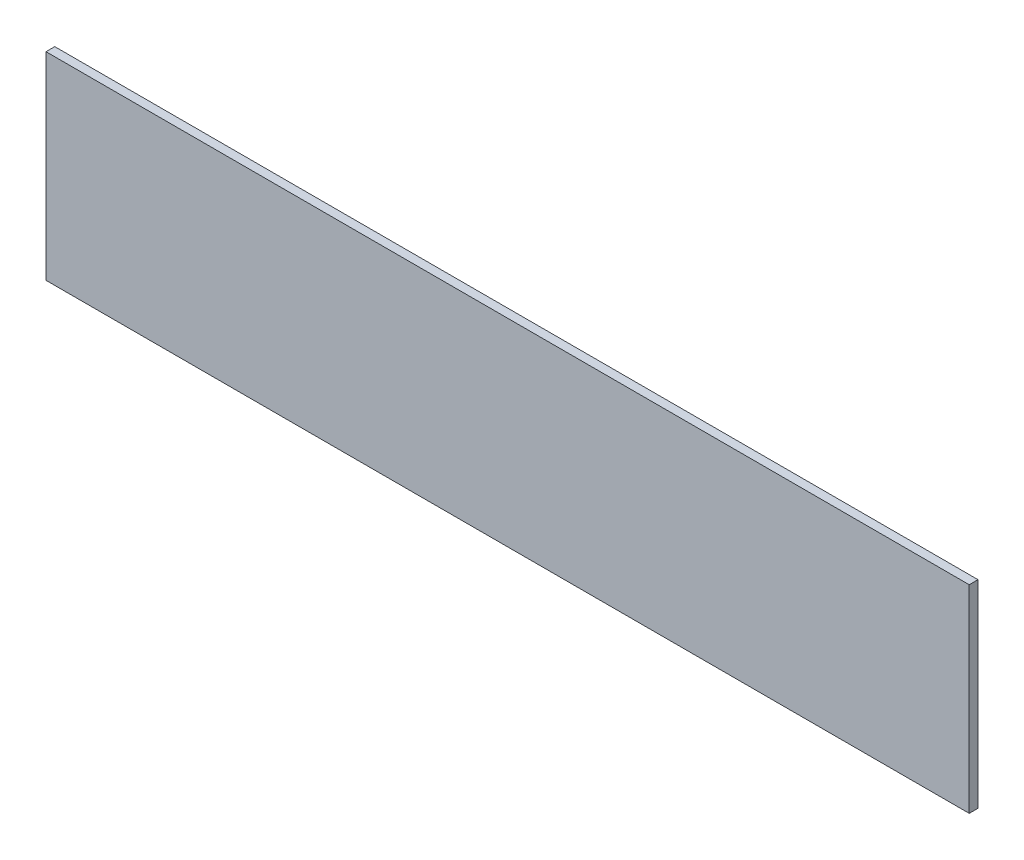
ISO-10303-21;
HEADER;
FILE_DESCRIPTION(('STEP AP214'),'2;1');
FILE_NAME('part.step','',(''),(''),'','','');
FILE_SCHEMA(('AUTOMOTIVE_DESIGN { 1 0 10303 214 1 1 1 1 }'));
ENDSEC;
DATA;
#1=APPLICATION_CONTEXT('core data for automotive mechanical design processes');
#2=APPLICATION_PROTOCOL_DEFINITION('international standard','automotive_design',2000,#1);
#3=PRODUCT_CONTEXT('',#1,'mechanical');
#4=PRODUCT('Part','Part','',(#3));
#5=PRODUCT_RELATED_PRODUCT_CATEGORY('part','',(#4));
#6=PRODUCT_DEFINITION_FORMATION('','',#4);
#7=PRODUCT_DEFINITION_CONTEXT('part definition',#1,'design');
#8=PRODUCT_DEFINITION('design','',#6,#7);
#9=PRODUCT_DEFINITION_SHAPE('','',#8);
#10=(LENGTH_UNIT() NAMED_UNIT(*) SI_UNIT(.MILLI.,.METRE.));
#11=(NAMED_UNIT(*) PLANE_ANGLE_UNIT() SI_UNIT($,.RADIAN.));
#12=(NAMED_UNIT(*) SI_UNIT($,.STERADIAN.) SOLID_ANGLE_UNIT());
#13=UNCERTAINTY_MEASURE_WITH_UNIT(LENGTH_MEASURE(1.E-05),#10,'distance_accuracy_value','');
#14=(GEOMETRIC_REPRESENTATION_CONTEXT(3) GLOBAL_UNCERTAINTY_ASSIGNED_CONTEXT((#13)) GLOBAL_UNIT_ASSIGNED_CONTEXT((#10,
#11,#12)) REPRESENTATION_CONTEXT('',''));
#15=CARTESIAN_POINT('',(0.,0.,0.));
#16=DIRECTION('',(0.,0.,1.));
#17=DIRECTION('',(1.,0.,0.));
#18=AXIS2_PLACEMENT_3D('',#15,#16,#17);
#19=CARTESIAN_POINT('',(0.,0.,1.9));
#20=DIRECTION('',(1.,0.,0.));
#21=DIRECTION('',(0.,0.,-1.));
#22=AXIS2_PLACEMENT_3D('',#19,#20,#21);
#23=PLANE('',#22);
#24=DIRECTION('',(0.,-1.,0.));
#25=VECTOR('',#24,1.);
#26=CARTESIAN_POINT('',(0.,0.,0.));
#27=LINE('',#26,#25);
#28=CARTESIAN_POINT('',(0.,42.9,0.));
#29=VERTEX_POINT('',#28);
#30=CARTESIAN_POINT('',(0.,0.,0.));
#31=VERTEX_POINT('',#30);
#32=EDGE_CURVE('E113',#29,#31,#27,.T.);
#33=ORIENTED_EDGE('',*,*,#32,.T.);
#34=DIRECTION('',(0.,0.,-1.));
#35=VECTOR('',#34,1.);
#36=CARTESIAN_POINT('',(0.,0.,1.9));
#37=LINE('',#36,#35);
#38=CARTESIAN_POINT('',(0.,0.,1.9));
#39=VERTEX_POINT('',#38);
#40=EDGE_CURVE('E11',#39,#31,#37,.T.);
#41=ORIENTED_EDGE('',*,*,#40,.F.);
#42=DIRECTION('',(0.,-1.,0.));
#43=VECTOR('',#42,1.);
#44=CARTESIAN_POINT('',(0.,0.,1.9));
#45=LINE('',#44,#43);
#46=CARTESIAN_POINT('',(0.,42.9,1.9));
#47=VERTEX_POINT('',#46);
#48=EDGE_CURVE('E97',#47,#39,#45,.T.);
#49=ORIENTED_EDGE('',*,*,#48,.F.);
#50=DIRECTION('',(0.,0.,-1.));
#51=VECTOR('',#50,1.);
#52=CARTESIAN_POINT('',(0.,42.9,1.9));
#53=LINE('',#52,#51);
#54=EDGE_CURVE('E109',#47,#29,#53,.T.);
#55=ORIENTED_EDGE('',*,*,#54,.T.);
#56=EDGE_LOOP('',(#33,#41,#49,#55));
#57=FACE_BOUND('',#56,.T.);
#58=ADVANCED_FACE('F45',(#57),#23,.F.);
#59=CARTESIAN_POINT('',(0.,0.,1.9));
#60=DIRECTION('',(0.,1.,0.));
#61=DIRECTION('',(0.,0.,1.));
#62=AXIS2_PLACEMENT_3D('',#59,#60,#61);
#63=PLANE('',#62);
#64=DIRECTION('',(1.,0.,0.));
#65=VECTOR('',#64,1.);
#66=CARTESIAN_POINT('',(0.,0.,0.));
#67=LINE('',#66,#65);
#68=CARTESIAN_POINT('',(200.,0.,0.));
#69=VERTEX_POINT('',#68);
#70=EDGE_CURVE('E102',#31,#69,#67,.T.);
#71=ORIENTED_EDGE('',*,*,#70,.T.);
#72=DIRECTION('',(0.,0.,-1.));
#73=VECTOR('',#72,1.);
#74=CARTESIAN_POINT('',(200.,0.,1.9));
#75=LINE('',#74,#73);
#76=CARTESIAN_POINT('',(200.,0.,1.9));
#77=VERTEX_POINT('',#76);
#78=EDGE_CURVE('E54',#77,#69,#75,.T.);
#79=ORIENTED_EDGE('',*,*,#78,.F.);
#80=DIRECTION('',(1.,0.,0.));
#81=VECTOR('',#80,1.);
#82=CARTESIAN_POINT('',(0.,0.,1.9));
#83=LINE('',#82,#81);
#84=EDGE_CURVE('E92',#39,#77,#83,.T.);
#85=ORIENTED_EDGE('',*,*,#84,.F.);
#86=ORIENTED_EDGE('',*,*,#40,.T.);
#87=EDGE_LOOP('',(#71,#79,#85,#86));
#88=FACE_BOUND('',#87,.T.);
#89=ADVANCED_FACE('F101',(#88),#63,.F.);
#90=CARTESIAN_POINT('',(200.,0.,1.9));
#91=DIRECTION('',(-1.,0.,0.));
#92=DIRECTION('',(0.,0.,1.));
#93=AXIS2_PLACEMENT_3D('',#90,#91,#92);
#94=PLANE('',#93);
#95=DIRECTION('',(0.,1.,0.));
#96=VECTOR('',#95,1.);
#97=CARTESIAN_POINT('',(200.,0.,0.));
#98=LINE('',#97,#96);
#99=CARTESIAN_POINT('',(200.,42.9,0.));
#100=VERTEX_POINT('',#99);
#101=EDGE_CURVE('E79',#69,#100,#98,.T.);
#102=ORIENTED_EDGE('',*,*,#101,.T.);
#103=DIRECTION('',(0.,0.,-1.));
#104=VECTOR('',#103,1.);
#105=CARTESIAN_POINT('',(200.,42.9,1.9));
#106=LINE('',#105,#104);
#107=CARTESIAN_POINT('',(200.,42.9,1.9));
#108=VERTEX_POINT('',#107);
#109=EDGE_CURVE('E104',#108,#100,#106,.T.);
#110=ORIENTED_EDGE('',*,*,#109,.F.);
#111=DIRECTION('',(0.,1.,0.));
#112=VECTOR('',#111,1.);
#113=CARTESIAN_POINT('',(200.,0.,1.9));
#114=LINE('',#113,#112);
#115=EDGE_CURVE('E95',#77,#108,#114,.T.);
#116=ORIENTED_EDGE('',*,*,#115,.F.);
#117=ORIENTED_EDGE('',*,*,#78,.T.);
#118=EDGE_LOOP('',(#102,#110,#116,#117));
#119=FACE_BOUND('',#118,.T.);
#120=ADVANCED_FACE('F105',(#119),#94,.F.);
#121=CARTESIAN_POINT('',(0.,42.9,1.9));
#122=DIRECTION('',(0.,-1.,0.));
#123=DIRECTION('',(0.,0.,-1.));
#124=AXIS2_PLACEMENT_3D('',#121,#122,#123);
#125=PLANE('',#124);
#126=DIRECTION('',(-1.,0.,0.));
#127=VECTOR('',#126,1.);
#128=CARTESIAN_POINT('',(0.,42.9,0.));
#129=LINE('',#128,#127);
#130=EDGE_CURVE('E85',#100,#29,#129,.T.);
#131=ORIENTED_EDGE('',*,*,#130,.T.);
#132=ORIENTED_EDGE('',*,*,#54,.F.);
#133=DIRECTION('',(-1.,0.,0.));
#134=VECTOR('',#133,1.);
#135=CARTESIAN_POINT('',(0.,42.9,1.9));
#136=LINE('',#135,#134);
#137=EDGE_CURVE('E62',#108,#47,#136,.T.);
#138=ORIENTED_EDGE('',*,*,#137,.F.);
#139=ORIENTED_EDGE('',*,*,#109,.T.);
#140=EDGE_LOOP('',(#131,#132,#138,#139));
#141=FACE_BOUND('',#140,.T.);
#142=ADVANCED_FACE('F126',(#141),#125,.F.);
#143=CARTESIAN_POINT('',(0.,0.,1.9));
#144=DIRECTION('',(0.,0.,-1.));
#145=DIRECTION('',(-1.,0.,0.));
#146=AXIS2_PLACEMENT_3D('',#143,#144,#145);
#147=PLANE('',#146);
#148=ORIENTED_EDGE('',*,*,#48,.T.);
#149=ORIENTED_EDGE('',*,*,#84,.T.);
#150=ORIENTED_EDGE('',*,*,#115,.T.);
#151=ORIENTED_EDGE('',*,*,#137,.T.);
#152=EDGE_LOOP('',(#148,#149,#150,#151));
#153=FACE_BOUND('',#152,.T.);
#154=ADVANCED_FACE('F93',(#153),#147,.F.);
#155=CARTESIAN_POINT('',(0.,0.,0.));
#156=DIRECTION('',(0.,0.,-1.));
#157=DIRECTION('',(-1.,0.,0.));
#158=AXIS2_PLACEMENT_3D('',#155,#156,#157);
#159=PLANE('',#158);
#160=ORIENTED_EDGE('',*,*,#32,.F.);
#161=ORIENTED_EDGE('',*,*,#130,.F.);
#162=ORIENTED_EDGE('',*,*,#101,.F.);
#163=ORIENTED_EDGE('',*,*,#70,.F.);
#164=EDGE_LOOP('',(#160,#161,#162,#163));
#165=FACE_BOUND('',#164,.T.);
#166=ADVANCED_FACE('F129',(#165),#159,.T.);
#167=CLOSED_SHELL('',(#58,#89,#120,#142,#154,#166));
#168=MANIFOLD_SOLID_BREP('B2',#167);
#169=ADVANCED_BREP_SHAPE_REPRESENTATION('',(#18,#168),#14);
#170=SHAPE_DEFINITION_REPRESENTATION(#9,#169);
ENDSEC;
END-ISO-10303-21;
